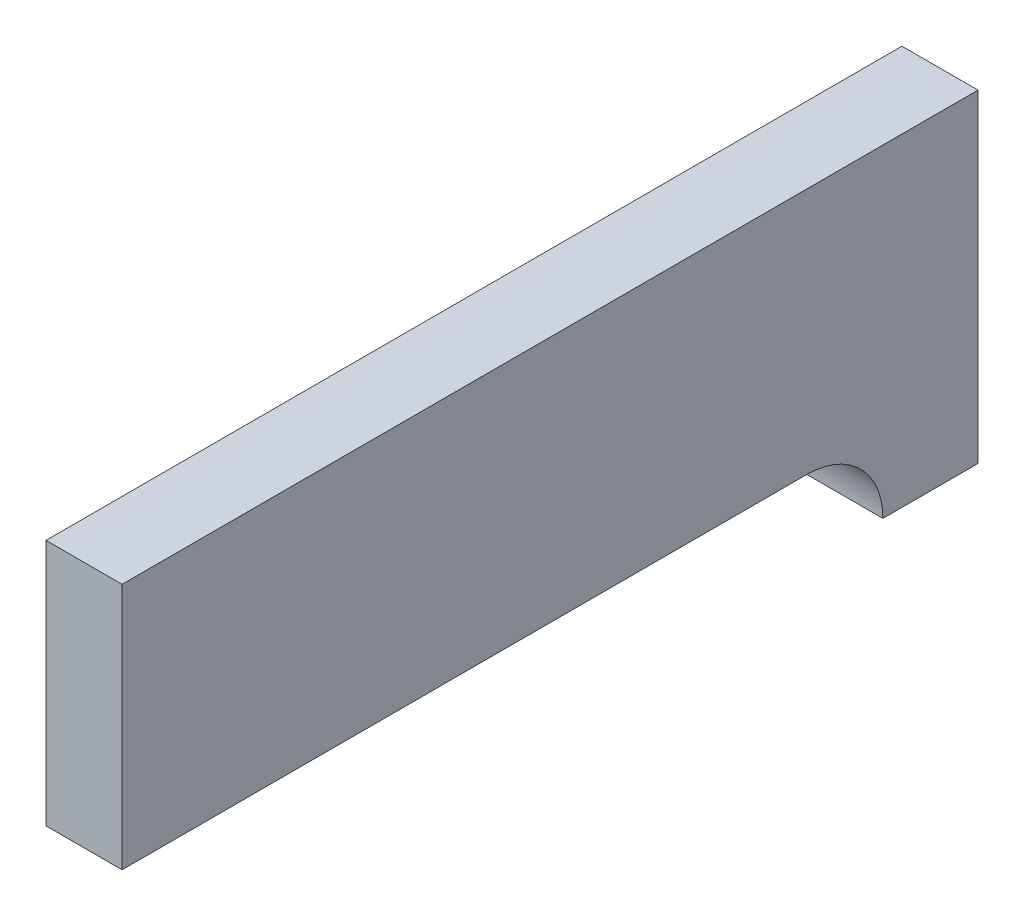
ISO-10303-21;
HEADER;
FILE_DESCRIPTION(('STEP AP214'),'2;1');
FILE_NAME('part.step','',(''),(''),'','','');
FILE_SCHEMA(('AUTOMOTIVE_DESIGN { 1 0 10303 214 1 1 1 1 }'));
ENDSEC;
DATA;
#1=APPLICATION_CONTEXT('core data for automotive mechanical design processes');
#2=APPLICATION_PROTOCOL_DEFINITION('international standard','automotive_design',2000,#1);
#3=PRODUCT_CONTEXT('',#1,'mechanical');
#4=PRODUCT('Part','Part','',(#3));
#5=PRODUCT_RELATED_PRODUCT_CATEGORY('part','',(#4));
#6=PRODUCT_DEFINITION_FORMATION('','',#4);
#7=PRODUCT_DEFINITION_CONTEXT('part definition',#1,'design');
#8=PRODUCT_DEFINITION('design','',#6,#7);
#9=PRODUCT_DEFINITION_SHAPE('','',#8);
#10=(LENGTH_UNIT() NAMED_UNIT(*) SI_UNIT(.MILLI.,.METRE.));
#11=(NAMED_UNIT(*) PLANE_ANGLE_UNIT() SI_UNIT($,.RADIAN.));
#12=(NAMED_UNIT(*) SI_UNIT($,.STERADIAN.) SOLID_ANGLE_UNIT());
#13=UNCERTAINTY_MEASURE_WITH_UNIT(LENGTH_MEASURE(1.E-05),#10,'distance_accuracy_value','');
#14=(GEOMETRIC_REPRESENTATION_CONTEXT(3) GLOBAL_UNCERTAINTY_ASSIGNED_CONTEXT((#13)) GLOBAL_UNIT_ASSIGNED_CONTEXT((#10,
#11,#12)) REPRESENTATION_CONTEXT('',''));
#15=CARTESIAN_POINT('',(0.,0.,0.));
#16=DIRECTION('',(0.,0.,1.));
#17=DIRECTION('',(1.,0.,0.));
#18=AXIS2_PLACEMENT_3D('',#15,#16,#17);
#19=CARTESIAN_POINT('',(0.,0.,10.));
#20=DIRECTION('',(1.,0.,0.));
#21=DIRECTION('',(0.,0.,-1.));
#22=AXIS2_PLACEMENT_3D('',#19,#20,#21);
#23=PLANE('',#22);
#24=DIRECTION('',(0.,0.,1.));
#25=VECTOR('',#24,1.);
#26=CARTESIAN_POINT('',(0.,39.,50.));
#27=LINE('',#26,#25);
#28=CARTESIAN_POINT('',(0.,39.,5.00000000000001));
#29=VERTEX_POINT('',#28);
#30=CARTESIAN_POINT('',(0.,39.,10.));
#31=VERTEX_POINT('',#30);
#32=EDGE_CURVE('E100',#29,#31,#27,.T.);
#33=ORIENTED_EDGE('',*,*,#32,.T.);
#34=CARTESIAN_POINT('',(0.,39.,14.));
#35=DIRECTION('',(1.,0.,0.));
#36=DIRECTION('',(0.,0.,-1.));
#37=AXIS2_PLACEMENT_3D('',#34,#35,#36);
#38=CIRCLE('',#37,4.);
#39=CARTESIAN_POINT('',(0.,43.,14.));
#40=VERTEX_POINT('',#39);
#41=EDGE_CURVE('E41',#31,#40,#38,.T.);
#42=ORIENTED_EDGE('',*,*,#41,.T.);
#43=DIRECTION('',(0.,0.,-1.));
#44=VECTOR('',#43,1.);
#45=CARTESIAN_POINT('',(0.,43.,50.));
#46=LINE('',#45,#44);
#47=CARTESIAN_POINT('',(0.,43.,50.));
#48=VERTEX_POINT('',#47);
#49=EDGE_CURVE('E118',#48,#40,#46,.T.);
#50=ORIENTED_EDGE('',*,*,#49,.F.);
#51=DIRECTION('',(0.,-1.,0.));
#52=VECTOR('',#51,1.);
#53=CARTESIAN_POINT('',(0.,53.,50.));
#54=LINE('',#53,#52);
#55=CARTESIAN_POINT('',(0.,56.,50.));
#56=VERTEX_POINT('',#55);
#57=EDGE_CURVE('E90',#56,#48,#54,.T.);
#58=ORIENTED_EDGE('',*,*,#57,.F.);
#59=DIRECTION('',(0.,0.,1.));
#60=VECTOR('',#59,1.);
#61=CARTESIAN_POINT('',(0.,56.,0.));
#62=LINE('',#61,#60);
#63=CARTESIAN_POINT('',(0.,56.,5.));
#64=VERTEX_POINT('',#63);
#65=EDGE_CURVE('E102',#64,#56,#62,.T.);
#66=ORIENTED_EDGE('',*,*,#65,.F.);
#67=DIRECTION('',(0.,-1.,0.));
#68=VECTOR('',#67,1.);
#69=CARTESIAN_POINT('',(0.,56.,5.));
#70=LINE('',#69,#68);
#71=EDGE_CURVE('E97',#64,#29,#70,.T.);
#72=ORIENTED_EDGE('',*,*,#71,.T.);
#73=EDGE_LOOP('',(#33,#42,#50,#58,#66,#72));
#74=FACE_BOUND('',#73,.T.);
#75=ADVANCED_FACE('F33',(#74),#23,.F.);
#76=CARTESIAN_POINT('',(0.,56.,0.));
#77=DIRECTION('',(0.,1.,0.));
#78=DIRECTION('',(0.,0.,1.));
#79=AXIS2_PLACEMENT_3D('',#76,#77,#78);
#80=PLANE('',#79);
#81=DIRECTION('',(0.,0.,-1.));
#82=VECTOR('',#81,1.);
#83=CARTESIAN_POINT('',(4.,56.,50.));
#84=LINE('',#83,#82);
#85=CARTESIAN_POINT('',(4.,56.,50.));
#86=VERTEX_POINT('',#85);
#87=CARTESIAN_POINT('',(4.,56.,5.));
#88=VERTEX_POINT('',#87);
#89=EDGE_CURVE('E85',#86,#88,#84,.T.);
#90=ORIENTED_EDGE('',*,*,#89,.T.);
#91=DIRECTION('',(-1.,0.,0.));
#92=VECTOR('',#91,1.);
#93=CARTESIAN_POINT('',(48.,56.,5.));
#94=LINE('',#93,#92);
#95=EDGE_CURVE('E55',#88,#64,#94,.T.);
#96=ORIENTED_EDGE('',*,*,#95,.T.);
#97=ORIENTED_EDGE('',*,*,#65,.T.);
#98=DIRECTION('',(1.,0.,0.));
#99=VECTOR('',#98,1.);
#100=CARTESIAN_POINT('',(0.,56.,50.));
#101=LINE('',#100,#99);
#102=EDGE_CURVE('E88',#56,#86,#101,.T.);
#103=ORIENTED_EDGE('',*,*,#102,.T.);
#104=EDGE_LOOP('',(#90,#96,#97,#103));
#105=FACE_BOUND('',#104,.T.);
#106=ADVANCED_FACE('F86',(#105),#80,.T.);
#107=CARTESIAN_POINT('',(0.,43.,50.));
#108=DIRECTION('',(0.,1.,0.));
#109=DIRECTION('',(0.,0.,1.));
#110=AXIS2_PLACEMENT_3D('',#107,#108,#109);
#111=PLANE('',#110);
#112=ORIENTED_EDGE('',*,*,#49,.T.);
#113=DIRECTION('',(1.,0.,0.));
#114=VECTOR('',#113,1.);
#115=CARTESIAN_POINT('',(4.,43.,14.));
#116=LINE('',#115,#114);
#117=CARTESIAN_POINT('',(4.,43.,14.));
#118=VERTEX_POINT('',#117);
#119=EDGE_CURVE('E121',#40,#118,#116,.T.);
#120=ORIENTED_EDGE('',*,*,#119,.T.);
#121=DIRECTION('',(0.,0.,-1.));
#122=VECTOR('',#121,1.);
#123=CARTESIAN_POINT('',(4.,43.,50.));
#124=LINE('',#123,#122);
#125=CARTESIAN_POINT('',(4.,43.,50.));
#126=VERTEX_POINT('',#125);
#127=EDGE_CURVE('E115',#126,#118,#124,.T.);
#128=ORIENTED_EDGE('',*,*,#127,.F.);
#129=DIRECTION('',(1.,0.,0.));
#130=VECTOR('',#129,1.);
#131=CARTESIAN_POINT('',(0.,43.,50.));
#132=LINE('',#131,#130);
#133=EDGE_CURVE('E111',#48,#126,#132,.T.);
#134=ORIENTED_EDGE('',*,*,#133,.F.);
#135=EDGE_LOOP('',(#112,#120,#128,#134));
#136=FACE_BOUND('',#135,.T.);
#137=ADVANCED_FACE('F136',(#136),#111,.F.);
#138=CARTESIAN_POINT('',(4.,53.,50.));
#139=DIRECTION('',(-1.,0.,0.));
#140=DIRECTION('',(0.,0.,1.));
#141=AXIS2_PLACEMENT_3D('',#138,#139,#140);
#142=PLANE('',#141);
#143=CARTESIAN_POINT('',(4.,39.,14.));
#144=DIRECTION('',(-1.,0.,0.));
#145=DIRECTION('',(0.,0.,1.));
#146=AXIS2_PLACEMENT_3D('',#143,#144,#145);
#147=CIRCLE('',#146,4.);
#148=CARTESIAN_POINT('',(4.,39.,10.));
#149=VERTEX_POINT('',#148);
#150=EDGE_CURVE('E126',#118,#149,#147,.T.);
#151=ORIENTED_EDGE('',*,*,#150,.T.);
#152=DIRECTION('',(0.,0.,-1.));
#153=VECTOR('',#152,1.);
#154=CARTESIAN_POINT('',(4.,39.,50.));
#155=LINE('',#154,#153);
#156=CARTESIAN_POINT('',(4.,39.,5.00000000000001));
#157=VERTEX_POINT('',#156);
#158=EDGE_CURVE('E47',#149,#157,#155,.T.);
#159=ORIENTED_EDGE('',*,*,#158,.T.);
#160=DIRECTION('',(0.,1.,0.));
#161=VECTOR('',#160,1.);
#162=CARTESIAN_POINT('',(4.,56.,5.));
#163=LINE('',#162,#161);
#164=EDGE_CURVE('E11',#157,#88,#163,.T.);
#165=ORIENTED_EDGE('',*,*,#164,.T.);
#166=ORIENTED_EDGE('',*,*,#89,.F.);
#167=DIRECTION('',(0.,1.,0.));
#168=VECTOR('',#167,1.);
#169=CARTESIAN_POINT('',(4.,53.,50.));
#170=LINE('',#169,#168);
#171=EDGE_CURVE('E113',#126,#86,#170,.T.);
#172=ORIENTED_EDGE('',*,*,#171,.F.);
#173=ORIENTED_EDGE('',*,*,#127,.T.);
#174=EDGE_LOOP('',(#151,#159,#165,#166,#172,#173));
#175=FACE_BOUND('',#174,.T.);
#176=ADVANCED_FACE('F92',(#175),#142,.F.);
#177=CARTESIAN_POINT('',(0.,0.,50.));
#178=DIRECTION('',(0.,0.,1.));
#179=DIRECTION('',(1.,0.,0.));
#180=AXIS2_PLACEMENT_3D('',#177,#178,#179);
#181=PLANE('',#180);
#182=ORIENTED_EDGE('',*,*,#57,.T.);
#183=ORIENTED_EDGE('',*,*,#133,.T.);
#184=ORIENTED_EDGE('',*,*,#171,.T.);
#185=ORIENTED_EDGE('',*,*,#102,.F.);
#186=EDGE_LOOP('',(#182,#183,#184,#185));
#187=FACE_BOUND('',#186,.T.);
#188=ADVANCED_FACE('F139',(#187),#181,.T.);
#189=CARTESIAN_POINT('',(0.,39.,14.));
#190=DIRECTION('',(-1.,0.,0.));
#191=DIRECTION('',(0.,0.,1.));
#192=AXIS2_PLACEMENT_3D('',#189,#190,#191);
#193=CYLINDRICAL_SURFACE('',#192,4.);
#194=ORIENTED_EDGE('',*,*,#41,.F.);
#195=DIRECTION('',(1.,0.,0.));
#196=VECTOR('',#195,1.);
#197=CARTESIAN_POINT('',(0.,39.,10.));
#198=LINE('',#197,#196);
#199=EDGE_CURVE('E124',#149,#31,#198,.F.);
#200=ORIENTED_EDGE('',*,*,#199,.F.);
#201=ORIENTED_EDGE('',*,*,#150,.F.);
#202=ORIENTED_EDGE('',*,*,#119,.F.);
#203=EDGE_LOOP('',(#194,#200,#201,#202));
#204=FACE_BOUND('',#203,.T.);
#205=ADVANCED_FACE('F35',(#204),#193,.F.);
#206=CARTESIAN_POINT('',(48.,39.,50.));
#207=DIRECTION('',(0.,-1.,0.));
#208=DIRECTION('',(0.,0.,-1.));
#209=AXIS2_PLACEMENT_3D('',#206,#207,#208);
#210=PLANE('',#209);
#211=ORIENTED_EDGE('',*,*,#158,.F.);
#212=ORIENTED_EDGE('',*,*,#199,.T.);
#213=ORIENTED_EDGE('',*,*,#32,.F.);
#214=DIRECTION('',(-1.,0.,0.));
#215=VECTOR('',#214,1.);
#216=CARTESIAN_POINT('',(48.,39.,5.00000000000001));
#217=LINE('',#216,#215);
#218=EDGE_CURVE('E99',#157,#29,#217,.T.);
#219=ORIENTED_EDGE('',*,*,#218,.F.);
#220=EDGE_LOOP('',(#211,#212,#213,#219));
#221=FACE_BOUND('',#220,.T.);
#222=ADVANCED_FACE('F149',(#221),#210,.T.);
#223=CARTESIAN_POINT('',(48.,56.,5.));
#224=DIRECTION('',(0.,0.,-1.));
#225=DIRECTION('',(0.,1.,0.));
#226=AXIS2_PLACEMENT_3D('',#223,#224,#225);
#227=PLANE('',#226);
#228=ORIENTED_EDGE('',*,*,#164,.F.);
#229=ORIENTED_EDGE('',*,*,#218,.T.);
#230=ORIENTED_EDGE('',*,*,#71,.F.);
#231=ORIENTED_EDGE('',*,*,#95,.F.);
#232=EDGE_LOOP('',(#228,#229,#230,#231));
#233=FACE_BOUND('',#232,.T.);
#234=ADVANCED_FACE('F95',(#233),#227,.T.);
#235=CLOSED_SHELL('',(#75,#106,#137,#176,#188,#205,#222,#234));
#236=MANIFOLD_SOLID_BREP('B2',#235);
#237=ADVANCED_BREP_SHAPE_REPRESENTATION('',(#18,#236),#14);
#238=SHAPE_DEFINITION_REPRESENTATION(#9,#237);
ENDSEC;
END-ISO-10303-21;
